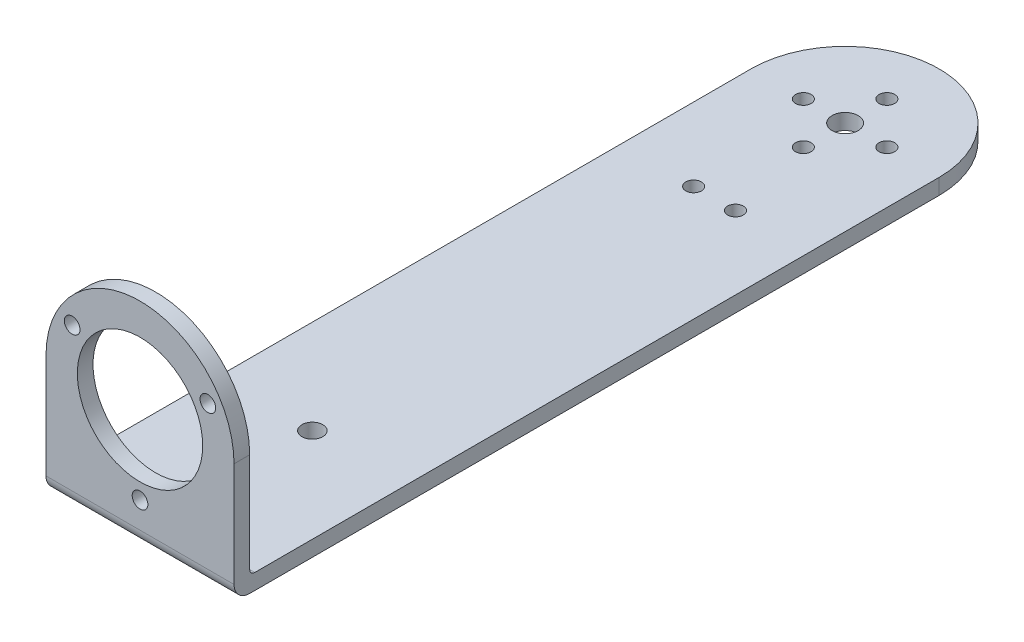
ISO-10303-21;
HEADER;
FILE_DESCRIPTION(('STEP AP214'),'2;1');
FILE_NAME('part.step','',(''),(''),'','','');
FILE_SCHEMA(('AUTOMOTIVE_DESIGN { 1 0 10303 214 1 1 1 1 }'));
ENDSEC;
DATA;
#1=APPLICATION_CONTEXT('core data for automotive mechanical design processes');
#2=APPLICATION_PROTOCOL_DEFINITION('international standard','automotive_design',2000,#1);
#3=PRODUCT_CONTEXT('',#1,'mechanical');
#4=PRODUCT('Part','Part','',(#3));
#5=PRODUCT_RELATED_PRODUCT_CATEGORY('part','',(#4));
#6=PRODUCT_DEFINITION_FORMATION('','',#4);
#7=PRODUCT_DEFINITION_CONTEXT('part definition',#1,'design');
#8=PRODUCT_DEFINITION('design','',#6,#7);
#9=PRODUCT_DEFINITION_SHAPE('','',#8);
#10=(LENGTH_UNIT() NAMED_UNIT(*) SI_UNIT(.MILLI.,.METRE.));
#11=(NAMED_UNIT(*) PLANE_ANGLE_UNIT() SI_UNIT($,.RADIAN.));
#12=(NAMED_UNIT(*) SI_UNIT($,.STERADIAN.) SOLID_ANGLE_UNIT());
#13=UNCERTAINTY_MEASURE_WITH_UNIT(LENGTH_MEASURE(1.E-05),#10,'distance_accuracy_value','');
#14=(GEOMETRIC_REPRESENTATION_CONTEXT(3) GLOBAL_UNCERTAINTY_ASSIGNED_CONTEXT((#13)) GLOBAL_UNIT_ASSIGNED_CONTEXT((#10,
#11,#12)) REPRESENTATION_CONTEXT('',''));
#15=CARTESIAN_POINT('',(0.,0.,0.));
#16=DIRECTION('',(0.,0.,1.));
#17=DIRECTION('',(1.,0.,0.));
#18=AXIS2_PLACEMENT_3D('',#15,#16,#17);
#19=CARTESIAN_POINT('',(0.,3.,67.5));
#20=DIRECTION('',(0.,0.,1.));
#21=DIRECTION('',(1.,0.,0.));
#22=AXIS2_PLACEMENT_3D('',#19,#20,#21);
#23=PLANE('',#22);
#24=CARTESIAN_POINT('',(0.,8.,67.5));
#25=DIRECTION('',(0.,0.,1.));
#26=DIRECTION('',(1.,0.,0.));
#27=AXIS2_PLACEMENT_3D('',#24,#25,#26);
#28=CIRCLE('',#27,1.5);
#29=CARTESIAN_POINT('',(1.5,8.,67.5));
#30=VERTEX_POINT('',#29);
#31=EDGE_CURVE('E146',#30,#30,#28,.T.);
#32=ORIENTED_EDGE('',*,*,#31,.F.);
#33=EDGE_LOOP('',(#32));
#34=FACE_BOUND('',#33,.T.);
#35=CARTESIAN_POINT('',(0.,23.,67.5));
#36=DIRECTION('',(0.,0.,1.));
#37=DIRECTION('',(1.,0.,0.));
#38=AXIS2_PLACEMENT_3D('',#35,#36,#37);
#39=CIRCLE('',#38,12.);
#40=CARTESIAN_POINT('',(12.,23.,67.5));
#41=VERTEX_POINT('',#40);
#42=EDGE_CURVE('E337',#41,#41,#39,.T.);
#43=ORIENTED_EDGE('',*,*,#42,.F.);
#44=EDGE_LOOP('',(#43));
#45=FACE_BOUND('',#44,.T.);
#46=CARTESIAN_POINT('',(12.9903810567665,30.5000000000001,67.5));
#47=DIRECTION('',(0.,0.,1.));
#48=DIRECTION('',(1.,0.,0.));
#49=AXIS2_PLACEMENT_3D('',#46,#47,#48);
#50=CIRCLE('',#49,1.5);
#51=CARTESIAN_POINT('',(14.4903810567665,30.5000000000001,67.5));
#52=VERTEX_POINT('',#51);
#53=EDGE_CURVE('E346',#52,#52,#50,.T.);
#54=ORIENTED_EDGE('',*,*,#53,.F.);
#55=EDGE_LOOP('',(#54));
#56=FACE_BOUND('',#55,.T.);
#57=CARTESIAN_POINT('',(-12.9903810567665,30.5000000000001,67.5));
#58=DIRECTION('',(0.,0.,1.));
#59=DIRECTION('',(1.,0.,0.));
#60=AXIS2_PLACEMENT_3D('',#57,#58,#59);
#61=CIRCLE('',#60,1.5);
#62=CARTESIAN_POINT('',(-11.4903810567665,30.5000000000001,67.5));
#63=VERTEX_POINT('',#62);
#64=EDGE_CURVE('E349',#63,#63,#61,.T.);
#65=ORIENTED_EDGE('',*,*,#64,.F.);
#66=EDGE_LOOP('',(#65));
#67=FACE_BOUND('',#66,.T.);
#68=DIRECTION('',(0.,-1.,0.));
#69=VECTOR('',#68,1.);
#70=CARTESIAN_POINT('',(-18.,3.,67.5));
#71=LINE('',#70,#69);
#72=CARTESIAN_POINT('',(-18.,23.,67.5));
#73=VERTEX_POINT('',#72);
#74=CARTESIAN_POINT('',(-18.,3.,67.5));
#75=VERTEX_POINT('',#74);
#76=EDGE_CURVE('E127',#73,#75,#71,.T.);
#77=ORIENTED_EDGE('',*,*,#76,.T.);
#78=DIRECTION('',(-1.,0.,0.));
#79=VECTOR('',#78,1.);
#80=CARTESIAN_POINT('',(18.,3.,67.5));
#81=LINE('',#80,#79);
#82=CARTESIAN_POINT('',(18.,3.,67.5));
#83=VERTEX_POINT('',#82);
#84=EDGE_CURVE('E126',#75,#83,#81,.F.);
#85=ORIENTED_EDGE('',*,*,#84,.T.);
#86=DIRECTION('',(0.,-1.,0.));
#87=VECTOR('',#86,1.);
#88=CARTESIAN_POINT('',(18.,3.,67.5));
#89=LINE('',#88,#87);
#90=CARTESIAN_POINT('',(18.,23.,67.5));
#91=VERTEX_POINT('',#90);
#92=EDGE_CURVE('E120',#91,#83,#89,.T.);
#93=ORIENTED_EDGE('',*,*,#92,.F.);
#94=CARTESIAN_POINT('',(0.,23.,67.5));
#95=DIRECTION('',(0.,0.,1.));
#96=DIRECTION('',(1.,0.,0.));
#97=AXIS2_PLACEMENT_3D('',#94,#95,#96);
#98=CIRCLE('',#97,18.);
#99=EDGE_CURVE('E103',#91,#73,#98,.T.);
#100=ORIENTED_EDGE('',*,*,#99,.T.);
#101=EDGE_LOOP('',(#77,#85,#93,#100));
#102=FACE_BOUND('',#101,.T.);
#103=ADVANCED_FACE('F41',(#34,#45,#56,#67,#102),#23,.T.);
#104=CARTESIAN_POINT('',(-18.,44.,64.5));
#105=DIRECTION('',(0.,0.,1.));
#106=DIRECTION('',(1.,0.,0.));
#107=AXIS2_PLACEMENT_3D('',#104,#105,#106);
#108=PLANE('',#107);
#109=CARTESIAN_POINT('',(0.,8.,64.5));
#110=DIRECTION('',(0.,0.,1.));
#111=DIRECTION('',(1.,0.,0.));
#112=AXIS2_PLACEMENT_3D('',#109,#110,#111);
#113=CIRCLE('',#112,1.5);
#114=CARTESIAN_POINT('',(1.5,8.,64.5));
#115=VERTEX_POINT('',#114);
#116=EDGE_CURVE('E114',#115,#115,#113,.T.);
#117=ORIENTED_EDGE('',*,*,#116,.T.);
#118=EDGE_LOOP('',(#117));
#119=FACE_BOUND('',#118,.T.);
#120=CARTESIAN_POINT('',(0.,23.,64.5));
#121=DIRECTION('',(0.,0.,1.));
#122=DIRECTION('',(1.,0.,0.));
#123=AXIS2_PLACEMENT_3D('',#120,#121,#122);
#124=CIRCLE('',#123,12.);
#125=CARTESIAN_POINT('',(12.,23.,64.5));
#126=VERTEX_POINT('',#125);
#127=EDGE_CURVE('E149',#126,#126,#124,.T.);
#128=ORIENTED_EDGE('',*,*,#127,.T.);
#129=EDGE_LOOP('',(#128));
#130=FACE_BOUND('',#129,.T.);
#131=CARTESIAN_POINT('',(12.9903810567665,30.5000000000001,64.5));
#132=DIRECTION('',(0.,0.,1.));
#133=DIRECTION('',(1.,0.,0.));
#134=AXIS2_PLACEMENT_3D('',#131,#132,#133);
#135=CIRCLE('',#134,1.5);
#136=CARTESIAN_POINT('',(14.4903810567665,30.5000000000001,64.5));
#137=VERTEX_POINT('',#136);
#138=EDGE_CURVE('E145',#137,#137,#135,.T.);
#139=ORIENTED_EDGE('',*,*,#138,.T.);
#140=EDGE_LOOP('',(#139));
#141=FACE_BOUND('',#140,.T.);
#142=CARTESIAN_POINT('',(-12.9903810567665,30.5000000000001,64.5));
#143=DIRECTION('',(0.,0.,1.));
#144=DIRECTION('',(1.,0.,0.));
#145=AXIS2_PLACEMENT_3D('',#142,#143,#144);
#146=CIRCLE('',#145,1.5);
#147=CARTESIAN_POINT('',(-11.4903810567665,30.5000000000001,64.5));
#148=VERTEX_POINT('',#147);
#149=EDGE_CURVE('E142',#148,#148,#146,.T.);
#150=ORIENTED_EDGE('',*,*,#149,.T.);
#151=EDGE_LOOP('',(#150));
#152=FACE_BOUND('',#151,.T.);
#153=DIRECTION('',(0.,-1.,0.));
#154=VECTOR('',#153,1.);
#155=CARTESIAN_POINT('',(18.,44.,64.5));
#156=LINE('',#155,#154);
#157=CARTESIAN_POINT('',(18.,23.,64.5));
#158=VERTEX_POINT('',#157);
#159=CARTESIAN_POINT('',(18.,4.,64.5));
#160=VERTEX_POINT('',#159);
#161=EDGE_CURVE('E123',#158,#160,#156,.T.);
#162=ORIENTED_EDGE('',*,*,#161,.T.);
#163=DIRECTION('',(-1.,0.,0.));
#164=VECTOR('',#163,1.);
#165=CARTESIAN_POINT('',(-18.,4.,64.5));
#166=LINE('',#165,#164);
#167=CARTESIAN_POINT('',(-18.,4.,64.5));
#168=VERTEX_POINT('',#167);
#169=EDGE_CURVE('E161',#160,#168,#166,.T.);
#170=ORIENTED_EDGE('',*,*,#169,.T.);
#171=DIRECTION('',(0.,-1.,0.));
#172=VECTOR('',#171,1.);
#173=CARTESIAN_POINT('',(-18.,44.,64.5));
#174=LINE('',#173,#172);
#175=CARTESIAN_POINT('',(-18.,23.,64.5));
#176=VERTEX_POINT('',#175);
#177=EDGE_CURVE('E168',#176,#168,#174,.T.);
#178=ORIENTED_EDGE('',*,*,#177,.F.);
#179=CARTESIAN_POINT('',(0.,23.,64.5));
#180=DIRECTION('',(0.,0.,1.));
#181=DIRECTION('',(1.,0.,0.));
#182=AXIS2_PLACEMENT_3D('',#179,#180,#181);
#183=CIRCLE('',#182,18.);
#184=EDGE_CURVE('E139',#158,#176,#183,.T.);
#185=ORIENTED_EDGE('',*,*,#184,.F.);
#186=EDGE_LOOP('',(#162,#170,#178,#185));
#187=FACE_BOUND('',#186,.T.);
#188=ADVANCED_FACE('F167',(#119,#130,#141,#152,#187),#108,.F.);
#189=CARTESIAN_POINT('',(0.,3.,-67.5));
#190=DIRECTION('',(0.,-1.,0.));
#191=DIRECTION('',(0.,0.,-1.));
#192=AXIS2_PLACEMENT_3D('',#189,#190,#191);
#193=CYLINDRICAL_SURFACE('',#192,18.);
#194=CARTESIAN_POINT('',(0.,0.,-67.5));
#195=DIRECTION('',(0.,1.,0.));
#196=DIRECTION('',(0.,0.,1.));
#197=AXIS2_PLACEMENT_3D('',#194,#195,#196);
#198=CIRCLE('',#197,18.);
#199=CARTESIAN_POINT('',(18.,0.,-67.5));
#200=VERTEX_POINT('',#199);
#201=CARTESIAN_POINT('',(-18.,0.,-67.5));
#202=VERTEX_POINT('',#201);
#203=EDGE_CURVE('E211',#200,#202,#198,.T.);
#204=ORIENTED_EDGE('',*,*,#203,.T.);
#205=DIRECTION('',(0.,-1.,0.));
#206=VECTOR('',#205,1.);
#207=CARTESIAN_POINT('',(-18.,3.,-67.5));
#208=LINE('',#207,#206);
#209=CARTESIAN_POINT('',(-18.,3.,-67.5));
#210=VERTEX_POINT('',#209);
#211=EDGE_CURVE('E130',#210,#202,#208,.T.);
#212=ORIENTED_EDGE('',*,*,#211,.F.);
#213=CARTESIAN_POINT('',(0.,3.,-67.5));
#214=DIRECTION('',(0.,1.,0.));
#215=DIRECTION('',(0.,0.,1.));
#216=AXIS2_PLACEMENT_3D('',#213,#214,#215);
#217=CIRCLE('',#216,18.);
#218=CARTESIAN_POINT('',(18.,3.,-67.5));
#219=VERTEX_POINT('',#218);
#220=EDGE_CURVE('E181',#219,#210,#217,.T.);
#221=ORIENTED_EDGE('',*,*,#220,.F.);
#222=DIRECTION('',(0.,-1.,0.));
#223=VECTOR('',#222,1.);
#224=CARTESIAN_POINT('',(18.,3.,-67.5));
#225=LINE('',#224,#223);
#226=EDGE_CURVE('E128',#219,#200,#225,.T.);
#227=ORIENTED_EDGE('',*,*,#226,.T.);
#228=EDGE_LOOP('',(#204,#212,#221,#227));
#229=FACE_BOUND('',#228,.T.);
#230=ADVANCED_FACE('F261',(#229),#193,.T.);
#231=CARTESIAN_POINT('',(-18.,3.,0.));
#232=DIRECTION('',(-1.,0.,0.));
#233=DIRECTION('',(0.,0.,1.));
#234=AXIS2_PLACEMENT_3D('',#231,#232,#233);
#235=PLANE('',#234);
#236=DIRECTION('',(0.,0.,-1.));
#237=VECTOR('',#236,1.);
#238=CARTESIAN_POINT('',(-18.,0.,0.));
#239=LINE('',#238,#237);
#240=CARTESIAN_POINT('',(-18.,0.,64.5));
#241=VERTEX_POINT('',#240);
#242=EDGE_CURVE('E214',#241,#202,#239,.T.);
#243=ORIENTED_EDGE('',*,*,#242,.F.);
#244=CARTESIAN_POINT('',(-18.,3.,64.5));
#245=DIRECTION('',(-1.,0.,0.));
#246=DIRECTION('',(0.,0.,1.));
#247=AXIS2_PLACEMENT_3D('',#244,#245,#246);
#248=CIRCLE('',#247,3.);
#249=EDGE_CURVE('E156',#241,#75,#248,.T.);
#250=ORIENTED_EDGE('',*,*,#249,.T.);
#251=ORIENTED_EDGE('',*,*,#76,.F.);
#252=DIRECTION('',(0.,0.,1.));
#253=VECTOR('',#252,1.);
#254=CARTESIAN_POINT('',(-18.,23.,63.5));
#255=LINE('',#254,#253);
#256=EDGE_CURVE('E109',#176,#73,#255,.T.);
#257=ORIENTED_EDGE('',*,*,#256,.F.);
#258=ORIENTED_EDGE('',*,*,#177,.T.);
#259=CARTESIAN_POINT('',(-18.,4.,63.5));
#260=DIRECTION('',(-1.,0.,0.));
#261=DIRECTION('',(0.,0.,1.));
#262=AXIS2_PLACEMENT_3D('',#259,#260,#261);
#263=CIRCLE('',#262,1.);
#264=CARTESIAN_POINT('',(-18.,3.,63.5));
#265=VERTEX_POINT('',#264);
#266=EDGE_CURVE('E49',#168,#265,#263,.F.);
#267=ORIENTED_EDGE('',*,*,#266,.T.);
#268=DIRECTION('',(0.,0.,-1.));
#269=VECTOR('',#268,1.);
#270=CARTESIAN_POINT('',(-18.,3.,0.));
#271=LINE('',#270,#269);
#272=EDGE_CURVE('E185',#265,#210,#271,.T.);
#273=ORIENTED_EDGE('',*,*,#272,.T.);
#274=ORIENTED_EDGE('',*,*,#211,.T.);
#275=EDGE_LOOP('',(#243,#250,#251,#257,#258,#267,#273,#274));
#276=FACE_BOUND('',#275,.T.);
#277=ADVANCED_FACE('F172',(#276),#235,.T.);
#278=CARTESIAN_POINT('',(3.99999999999999,3.,-42.5));
#279=DIRECTION('',(0.,-1.,0.));
#280=DIRECTION('',(0.,0.,-1.));
#281=AXIS2_PLACEMENT_3D('',#278,#279,#280);
#282=CYLINDRICAL_SURFACE('',#281,1.5);
#283=CARTESIAN_POINT('',(3.99999999999999,3.,-42.5));
#284=DIRECTION('',(0.,1.,0.));
#285=DIRECTION('',(0.,0.,1.));
#286=AXIS2_PLACEMENT_3D('',#283,#284,#285);
#287=CIRCLE('',#286,1.5);
#288=CARTESIAN_POINT('',(3.99999999999999,3.,-41.));
#289=VERTEX_POINT('',#288);
#290=EDGE_CURVE('E204',#289,#289,#287,.F.);
#291=ORIENTED_EDGE('',*,*,#290,.F.);
#292=EDGE_LOOP('',(#291));
#293=FACE_BOUND('',#292,.T.);
#294=CARTESIAN_POINT('',(3.99999999999999,0.,-42.5));
#295=DIRECTION('',(0.,1.,0.));
#296=DIRECTION('',(0.,0.,1.));
#297=AXIS2_PLACEMENT_3D('',#294,#295,#296);
#298=CIRCLE('',#297,1.5);
#299=CARTESIAN_POINT('',(3.99999999999999,0.,-41.));
#300=VERTEX_POINT('',#299);
#301=EDGE_CURVE('E233',#300,#300,#298,.F.);
#302=ORIENTED_EDGE('',*,*,#301,.T.);
#303=EDGE_LOOP('',(#302));
#304=FACE_BOUND('',#303,.T.);
#305=ADVANCED_FACE('F271',(#293,#304),#282,.F.);
#306=CARTESIAN_POINT('',(-4.,3.,-42.5));
#307=DIRECTION('',(0.,-1.,0.));
#308=DIRECTION('',(0.,0.,-1.));
#309=AXIS2_PLACEMENT_3D('',#306,#307,#308);
#310=CYLINDRICAL_SURFACE('',#309,1.5);
#311=CARTESIAN_POINT('',(-4.,3.,-42.5));
#312=DIRECTION('',(0.,1.,0.));
#313=DIRECTION('',(0.,0.,1.));
#314=AXIS2_PLACEMENT_3D('',#311,#312,#313);
#315=CIRCLE('',#314,1.5);
#316=CARTESIAN_POINT('',(-4.,3.,-41.));
#317=VERTEX_POINT('',#316);
#318=EDGE_CURVE('E201',#317,#317,#315,.T.);
#319=ORIENTED_EDGE('',*,*,#318,.T.);
#320=EDGE_LOOP('',(#319));
#321=FACE_BOUND('',#320,.T.);
#322=CARTESIAN_POINT('',(-4.,0.,-42.5));
#323=DIRECTION('',(0.,1.,0.));
#324=DIRECTION('',(0.,0.,1.));
#325=AXIS2_PLACEMENT_3D('',#322,#323,#324);
#326=CIRCLE('',#325,1.5);
#327=CARTESIAN_POINT('',(-4.,0.,-41.));
#328=VERTEX_POINT('',#327);
#329=EDGE_CURVE('E230',#328,#328,#326,.T.);
#330=ORIENTED_EDGE('',*,*,#329,.F.);
#331=EDGE_LOOP('',(#330));
#332=FACE_BOUND('',#331,.T.);
#333=ADVANCED_FACE('F312',(#321,#332),#310,.F.);
#334=CARTESIAN_POINT('',(0.,3.,-67.5));
#335=DIRECTION('',(0.,-1.,0.));
#336=DIRECTION('',(0.,0.,-1.));
#337=AXIS2_PLACEMENT_3D('',#334,#335,#336);
#338=CYLINDRICAL_SURFACE('',#337,2.5);
#339=CARTESIAN_POINT('',(0.,3.,-67.5));
#340=DIRECTION('',(0.,1.,0.));
#341=DIRECTION('',(0.,0.,1.));
#342=AXIS2_PLACEMENT_3D('',#339,#340,#341);
#343=CIRCLE('',#342,2.5);
#344=CARTESIAN_POINT('',(0.,3.,-65.));
#345=VERTEX_POINT('',#344);
#346=EDGE_CURVE('E198',#345,#345,#343,.T.);
#347=ORIENTED_EDGE('',*,*,#346,.T.);
#348=EDGE_LOOP('',(#347));
#349=FACE_BOUND('',#348,.T.);
#350=CARTESIAN_POINT('',(0.,0.,-67.5));
#351=DIRECTION('',(0.,1.,0.));
#352=DIRECTION('',(0.,0.,1.));
#353=AXIS2_PLACEMENT_3D('',#350,#351,#352);
#354=CIRCLE('',#353,2.5);
#355=CARTESIAN_POINT('',(0.,0.,-65.));
#356=VERTEX_POINT('',#355);
#357=EDGE_CURVE('E227',#356,#356,#354,.T.);
#358=ORIENTED_EDGE('',*,*,#357,.F.);
#359=EDGE_LOOP('',(#358));
#360=FACE_BOUND('',#359,.T.);
#361=ADVANCED_FACE('F460',(#349,#360),#338,.F.);
#362=CARTESIAN_POINT('',(0.,3.,-59.5));
#363=DIRECTION('',(0.,-1.,0.));
#364=DIRECTION('',(0.,0.,-1.));
#365=AXIS2_PLACEMENT_3D('',#362,#363,#364);
#366=CYLINDRICAL_SURFACE('',#365,1.5);
#367=CARTESIAN_POINT('',(0.,3.,-59.5));
#368=DIRECTION('',(0.,1.,0.));
#369=DIRECTION('',(0.,0.,1.));
#370=AXIS2_PLACEMENT_3D('',#367,#368,#369);
#371=CIRCLE('',#370,1.5);
#372=CARTESIAN_POINT('',(0.,3.,-58.));
#373=VERTEX_POINT('',#372);
#374=EDGE_CURVE('E195',#373,#373,#371,.T.);
#375=ORIENTED_EDGE('',*,*,#374,.T.);
#376=EDGE_LOOP('',(#375));
#377=FACE_BOUND('',#376,.T.);
#378=CARTESIAN_POINT('',(0.,0.,-59.5));
#379=DIRECTION('',(0.,1.,0.));
#380=DIRECTION('',(0.,0.,1.));
#381=AXIS2_PLACEMENT_3D('',#378,#379,#380);
#382=CIRCLE('',#381,1.5);
#383=CARTESIAN_POINT('',(0.,0.,-58.));
#384=VERTEX_POINT('',#383);
#385=EDGE_CURVE('E224',#384,#384,#382,.T.);
#386=ORIENTED_EDGE('',*,*,#385,.F.);
#387=EDGE_LOOP('',(#386));
#388=FACE_BOUND('',#387,.T.);
#389=ADVANCED_FACE('F451',(#377,#388),#366,.F.);
#390=CARTESIAN_POINT('',(0.,3.,34.5));
#391=DIRECTION('',(0.,-1.,0.));
#392=DIRECTION('',(0.,0.,-1.));
#393=AXIS2_PLACEMENT_3D('',#390,#391,#392);
#394=CYLINDRICAL_SURFACE('',#393,2.);
#395=CARTESIAN_POINT('',(0.,3.,34.5));
#396=DIRECTION('',(0.,1.,0.));
#397=DIRECTION('',(0.,0.,1.));
#398=AXIS2_PLACEMENT_3D('',#395,#396,#397);
#399=CIRCLE('',#398,2.);
#400=CARTESIAN_POINT('',(0.,3.,36.5));
#401=VERTEX_POINT('',#400);
#402=EDGE_CURVE('E192',#401,#401,#399,.T.);
#403=ORIENTED_EDGE('',*,*,#402,.T.);
#404=EDGE_LOOP('',(#403));
#405=FACE_BOUND('',#404,.T.);
#406=CARTESIAN_POINT('',(0.,0.,34.5));
#407=DIRECTION('',(0.,1.,0.));
#408=DIRECTION('',(0.,0.,1.));
#409=AXIS2_PLACEMENT_3D('',#406,#407,#408);
#410=CIRCLE('',#409,2.);
#411=CARTESIAN_POINT('',(0.,0.,36.5));
#412=VERTEX_POINT('',#411);
#413=EDGE_CURVE('E221',#412,#412,#410,.T.);
#414=ORIENTED_EDGE('',*,*,#413,.F.);
#415=EDGE_LOOP('',(#414));
#416=FACE_BOUND('',#415,.T.);
#417=ADVANCED_FACE('F443',(#405,#416),#394,.F.);
#418=CARTESIAN_POINT('',(8.,3.,-67.5));
#419=DIRECTION('',(0.,-1.,0.));
#420=DIRECTION('',(0.,0.,-1.));
#421=AXIS2_PLACEMENT_3D('',#418,#419,#420);
#422=CYLINDRICAL_SURFACE('',#421,1.5);
#423=CARTESIAN_POINT('',(8.,3.,-67.5));
#424=DIRECTION('',(0.,1.,0.));
#425=DIRECTION('',(0.,0.,1.));
#426=AXIS2_PLACEMENT_3D('',#423,#424,#425);
#427=CIRCLE('',#426,1.5);
#428=CARTESIAN_POINT('',(8.,3.,-66.));
#429=VERTEX_POINT('',#428);
#430=EDGE_CURVE('E189',#429,#429,#427,.T.);
#431=ORIENTED_EDGE('',*,*,#430,.T.);
#432=EDGE_LOOP('',(#431));
#433=FACE_BOUND('',#432,.T.);
#434=CARTESIAN_POINT('',(8.,0.,-67.5));
#435=DIRECTION('',(0.,1.,0.));
#436=DIRECTION('',(0.,0.,1.));
#437=AXIS2_PLACEMENT_3D('',#434,#435,#436);
#438=CIRCLE('',#437,1.5);
#439=CARTESIAN_POINT('',(8.,0.,-66.));
#440=VERTEX_POINT('',#439);
#441=EDGE_CURVE('E218',#440,#440,#438,.T.);
#442=ORIENTED_EDGE('',*,*,#441,.F.);
#443=EDGE_LOOP('',(#442));
#444=FACE_BOUND('',#443,.T.);
#445=ADVANCED_FACE('F405',(#433,#444),#422,.F.);
#446=CARTESIAN_POINT('',(18.,3.,0.));
#447=DIRECTION('',(-1.,0.,0.));
#448=DIRECTION('',(0.,0.,1.));
#449=AXIS2_PLACEMENT_3D('',#446,#447,#448);
#450=PLANE('',#449);
#451=ORIENTED_EDGE('',*,*,#92,.T.);
#452=CARTESIAN_POINT('',(18.,3.,64.5));
#453=DIRECTION('',(-1.,0.,0.));
#454=DIRECTION('',(0.,0.,1.));
#455=AXIS2_PLACEMENT_3D('',#452,#453,#454);
#456=CIRCLE('',#455,3.);
#457=CARTESIAN_POINT('',(18.,0.,64.5));
#458=VERTEX_POINT('',#457);
#459=EDGE_CURVE('E159',#83,#458,#456,.F.);
#460=ORIENTED_EDGE('',*,*,#459,.T.);
#461=DIRECTION('',(0.,0.,-1.));
#462=VECTOR('',#461,1.);
#463=CARTESIAN_POINT('',(18.,0.,0.));
#464=LINE('',#463,#462);
#465=EDGE_CURVE('E216',#458,#200,#464,.T.);
#466=ORIENTED_EDGE('',*,*,#465,.T.);
#467=ORIENTED_EDGE('',*,*,#226,.F.);
#468=DIRECTION('',(0.,0.,-1.));
#469=VECTOR('',#468,1.);
#470=CARTESIAN_POINT('',(18.,3.,0.));
#471=LINE('',#470,#469);
#472=CARTESIAN_POINT('',(18.,3.,63.5));
#473=VERTEX_POINT('',#472);
#474=EDGE_CURVE('E187',#473,#219,#471,.T.);
#475=ORIENTED_EDGE('',*,*,#474,.F.);
#476=CARTESIAN_POINT('',(18.,4.,63.5));
#477=DIRECTION('',(-1.,0.,0.));
#478=DIRECTION('',(0.,0.,1.));
#479=AXIS2_PLACEMENT_3D('',#476,#477,#478);
#480=CIRCLE('',#479,1.);
#481=EDGE_CURVE('E11',#473,#160,#480,.T.);
#482=ORIENTED_EDGE('',*,*,#481,.T.);
#483=ORIENTED_EDGE('',*,*,#161,.F.);
#484=DIRECTION('',(0.,0.,1.));
#485=VECTOR('',#484,1.);
#486=CARTESIAN_POINT('',(18.,23.,63.5));
#487=LINE('',#486,#485);
#488=EDGE_CURVE('E106',#158,#91,#487,.T.);
#489=ORIENTED_EDGE('',*,*,#488,.T.);
#490=EDGE_LOOP('',(#451,#460,#466,#467,#475,#482,#483,#489));
#491=FACE_BOUND('',#490,.T.);
#492=ADVANCED_FACE('F119',(#491),#450,.F.);
#493=CARTESIAN_POINT('',(-8.00000000000001,3.,-67.5));
#494=DIRECTION('',(0.,-1.,0.));
#495=DIRECTION('',(0.,0.,-1.));
#496=AXIS2_PLACEMENT_3D('',#493,#494,#495);
#497=CYLINDRICAL_SURFACE('',#496,1.5);
#498=CARTESIAN_POINT('',(-8.00000000000001,3.,-67.5));
#499=DIRECTION('',(0.,1.,0.));
#500=DIRECTION('',(0.,0.,1.));
#501=AXIS2_PLACEMENT_3D('',#498,#499,#500);
#502=CIRCLE('',#501,1.5);
#503=CARTESIAN_POINT('',(-8.00000000000001,3.,-66.));
#504=VERTEX_POINT('',#503);
#505=EDGE_CURVE('E178',#504,#504,#502,.T.);
#506=ORIENTED_EDGE('',*,*,#505,.T.);
#507=EDGE_LOOP('',(#506));
#508=FACE_BOUND('',#507,.T.);
#509=CARTESIAN_POINT('',(-8.00000000000001,0.,-67.5));
#510=DIRECTION('',(0.,1.,0.));
#511=DIRECTION('',(0.,0.,1.));
#512=AXIS2_PLACEMENT_3D('',#509,#510,#511);
#513=CIRCLE('',#512,1.5);
#514=CARTESIAN_POINT('',(-8.00000000000001,0.,-66.));
#515=VERTEX_POINT('',#514);
#516=EDGE_CURVE('E174',#515,#515,#513,.T.);
#517=ORIENTED_EDGE('',*,*,#516,.F.);
#518=EDGE_LOOP('',(#517));
#519=FACE_BOUND('',#518,.T.);
#520=ADVANCED_FACE('F243',(#508,#519),#497,.F.);
#521=CARTESIAN_POINT('',(0.,3.,-75.5));
#522=DIRECTION('',(0.,-1.,0.));
#523=DIRECTION('',(0.,0.,-1.));
#524=AXIS2_PLACEMENT_3D('',#521,#522,#523);
#525=CYLINDRICAL_SURFACE('',#524,1.5);
#526=CARTESIAN_POINT('',(0.,3.,-75.5));
#527=DIRECTION('',(0.,1.,0.));
#528=DIRECTION('',(0.,0.,1.));
#529=AXIS2_PLACEMENT_3D('',#526,#527,#528);
#530=CIRCLE('',#529,1.5);
#531=CARTESIAN_POINT('',(0.,3.,-74.));
#532=VERTEX_POINT('',#531);
#533=EDGE_CURVE('E133',#532,#532,#530,.T.);
#534=ORIENTED_EDGE('',*,*,#533,.T.);
#535=EDGE_LOOP('',(#534));
#536=FACE_BOUND('',#535,.T.);
#537=CARTESIAN_POINT('',(0.,0.,-75.5));
#538=DIRECTION('',(0.,1.,0.));
#539=DIRECTION('',(0.,0.,1.));
#540=AXIS2_PLACEMENT_3D('',#537,#538,#539);
#541=CIRCLE('',#540,1.5);
#542=CARTESIAN_POINT('',(0.,0.,-74.));
#543=VERTEX_POINT('',#542);
#544=EDGE_CURVE('E182',#543,#543,#541,.T.);
#545=ORIENTED_EDGE('',*,*,#544,.F.);
#546=EDGE_LOOP('',(#545));
#547=FACE_BOUND('',#546,.T.);
#548=ADVANCED_FACE('F240',(#536,#547),#525,.F.);
#549=CARTESIAN_POINT('',(0.,3.,0.));
#550=DIRECTION('',(0.,1.,0.));
#551=DIRECTION('',(0.,0.,1.));
#552=AXIS2_PLACEMENT_3D('',#549,#550,#551);
#553=PLANE('',#552);
#554=ORIENTED_EDGE('',*,*,#272,.F.);
#555=DIRECTION('',(-1.,0.,0.));
#556=VECTOR('',#555,1.);
#557=CARTESIAN_POINT('',(0.,3.,63.5));
#558=LINE('',#557,#556);
#559=EDGE_CURVE('E62',#265,#473,#558,.F.);
#560=ORIENTED_EDGE('',*,*,#559,.T.);
#561=ORIENTED_EDGE('',*,*,#474,.T.);
#562=ORIENTED_EDGE('',*,*,#220,.T.);
#563=EDGE_LOOP('',(#554,#560,#561,#562));
#564=FACE_BOUND('',#563,.T.);
#565=ORIENTED_EDGE('',*,*,#505,.F.);
#566=EDGE_LOOP('',(#565));
#567=FACE_BOUND('',#566,.T.);
#568=ORIENTED_EDGE('',*,*,#430,.F.);
#569=EDGE_LOOP('',(#568));
#570=FACE_BOUND('',#569,.T.);
#571=ORIENTED_EDGE('',*,*,#402,.F.);
#572=EDGE_LOOP('',(#571));
#573=FACE_BOUND('',#572,.T.);
#574=ORIENTED_EDGE('',*,*,#374,.F.);
#575=EDGE_LOOP('',(#574));
#576=FACE_BOUND('',#575,.T.);
#577=ORIENTED_EDGE('',*,*,#346,.F.);
#578=EDGE_LOOP('',(#577));
#579=FACE_BOUND('',#578,.T.);
#580=ORIENTED_EDGE('',*,*,#318,.F.);
#581=EDGE_LOOP('',(#580));
#582=FACE_BOUND('',#581,.T.);
#583=ORIENTED_EDGE('',*,*,#290,.T.);
#584=EDGE_LOOP('',(#583));
#585=FACE_BOUND('',#584,.T.);
#586=ORIENTED_EDGE('',*,*,#533,.F.);
#587=EDGE_LOOP('',(#586));
#588=FACE_BOUND('',#587,.T.);
#589=ADVANCED_FACE('F242',(#564,#567,#570,#573,#576,#579,#582,#585,#588),#553,.T.);
#590=CARTESIAN_POINT('',(0.,0.,0.));
#591=DIRECTION('',(0.,1.,0.));
#592=DIRECTION('',(0.,0.,1.));
#593=AXIS2_PLACEMENT_3D('',#590,#591,#592);
#594=PLANE('',#593);
#595=ORIENTED_EDGE('',*,*,#516,.T.);
#596=EDGE_LOOP('',(#595));
#597=FACE_BOUND('',#596,.T.);
#598=ORIENTED_EDGE('',*,*,#465,.F.);
#599=DIRECTION('',(-1.,0.,0.));
#600=VECTOR('',#599,1.);
#601=CARTESIAN_POINT('',(-18.,0.,64.5));
#602=LINE('',#601,#600);
#603=EDGE_CURVE('E141',#458,#241,#602,.T.);
#604=ORIENTED_EDGE('',*,*,#603,.T.);
#605=ORIENTED_EDGE('',*,*,#242,.T.);
#606=ORIENTED_EDGE('',*,*,#203,.F.);
#607=EDGE_LOOP('',(#598,#604,#605,#606));
#608=FACE_BOUND('',#607,.T.);
#609=ORIENTED_EDGE('',*,*,#441,.T.);
#610=EDGE_LOOP('',(#609));
#611=FACE_BOUND('',#610,.T.);
#612=ORIENTED_EDGE('',*,*,#413,.T.);
#613=EDGE_LOOP('',(#612));
#614=FACE_BOUND('',#613,.T.);
#615=ORIENTED_EDGE('',*,*,#385,.T.);
#616=EDGE_LOOP('',(#615));
#617=FACE_BOUND('',#616,.T.);
#618=ORIENTED_EDGE('',*,*,#357,.T.);
#619=EDGE_LOOP('',(#618));
#620=FACE_BOUND('',#619,.T.);
#621=ORIENTED_EDGE('',*,*,#329,.T.);
#622=EDGE_LOOP('',(#621));
#623=FACE_BOUND('',#622,.T.);
#624=ORIENTED_EDGE('',*,*,#301,.F.);
#625=EDGE_LOOP('',(#624));
#626=FACE_BOUND('',#625,.T.);
#627=ORIENTED_EDGE('',*,*,#544,.T.);
#628=EDGE_LOOP('',(#627));
#629=FACE_BOUND('',#628,.T.);
#630=ADVANCED_FACE('F238',(#597,#608,#611,#614,#617,#620,#623,#626,#629),#594,.F.);
#631=CARTESIAN_POINT('',(0.,23.,63.5));
#632=DIRECTION('',(0.,0.,1.));
#633=DIRECTION('',(1.,0.,0.));
#634=AXIS2_PLACEMENT_3D('',#631,#632,#633);
#635=CYLINDRICAL_SURFACE('',#634,18.);
#636=ORIENTED_EDGE('',*,*,#184,.T.);
#637=ORIENTED_EDGE('',*,*,#256,.T.);
#638=ORIENTED_EDGE('',*,*,#99,.F.);
#639=ORIENTED_EDGE('',*,*,#488,.F.);
#640=EDGE_LOOP('',(#636,#637,#638,#639));
#641=FACE_BOUND('',#640,.T.);
#642=ADVANCED_FACE('F105',(#641),#635,.T.);
#643=CARTESIAN_POINT('',(-12.9903810567665,30.5000000000001,63.5));
#644=DIRECTION('',(0.,0.,1.));
#645=DIRECTION('',(1.,0.,0.));
#646=AXIS2_PLACEMENT_3D('',#643,#644,#645);
#647=CYLINDRICAL_SURFACE('',#646,1.5);
#648=ORIENTED_EDGE('',*,*,#64,.T.);
#649=EDGE_LOOP('',(#648));
#650=FACE_BOUND('',#649,.T.);
#651=ORIENTED_EDGE('',*,*,#149,.F.);
#652=EDGE_LOOP('',(#651));
#653=FACE_BOUND('',#652,.T.);
#654=ADVANCED_FACE('F320',(#650,#653),#647,.F.);
#655=CARTESIAN_POINT('',(12.9903810567665,30.5000000000001,63.5));
#656=DIRECTION('',(0.,0.,1.));
#657=DIRECTION('',(1.,0.,0.));
#658=AXIS2_PLACEMENT_3D('',#655,#656,#657);
#659=CYLINDRICAL_SURFACE('',#658,1.5);
#660=ORIENTED_EDGE('',*,*,#53,.T.);
#661=EDGE_LOOP('',(#660));
#662=FACE_BOUND('',#661,.T.);
#663=ORIENTED_EDGE('',*,*,#138,.F.);
#664=EDGE_LOOP('',(#663));
#665=FACE_BOUND('',#664,.T.);
#666=ADVANCED_FACE('F323',(#662,#665),#659,.F.);
#667=CARTESIAN_POINT('',(0.,23.,63.5));
#668=DIRECTION('',(0.,0.,1.));
#669=DIRECTION('',(1.,0.,0.));
#670=AXIS2_PLACEMENT_3D('',#667,#668,#669);
#671=CYLINDRICAL_SURFACE('',#670,12.);
#672=ORIENTED_EDGE('',*,*,#42,.T.);
#673=EDGE_LOOP('',(#672));
#674=FACE_BOUND('',#673,.T.);
#675=ORIENTED_EDGE('',*,*,#127,.F.);
#676=EDGE_LOOP('',(#675));
#677=FACE_BOUND('',#676,.T.);
#678=ADVANCED_FACE('F282',(#674,#677),#671,.F.);
#679=CARTESIAN_POINT('',(0.,8.,63.5));
#680=DIRECTION('',(0.,0.,1.));
#681=DIRECTION('',(1.,0.,0.));
#682=AXIS2_PLACEMENT_3D('',#679,#680,#681);
#683=CYLINDRICAL_SURFACE('',#682,1.5);
#684=ORIENTED_EDGE('',*,*,#31,.T.);
#685=EDGE_LOOP('',(#684));
#686=FACE_BOUND('',#685,.T.);
#687=ORIENTED_EDGE('',*,*,#116,.F.);
#688=EDGE_LOOP('',(#687));
#689=FACE_BOUND('',#688,.T.);
#690=ADVANCED_FACE('F276',(#686,#689),#683,.F.);
#691=CARTESIAN_POINT('',(0.,3.,64.5));
#692=DIRECTION('',(1.,0.,0.));
#693=DIRECTION('',(0.,0.,-1.));
#694=AXIS2_PLACEMENT_3D('',#691,#692,#693);
#695=CYLINDRICAL_SURFACE('',#694,3.);
#696=ORIENTED_EDGE('',*,*,#459,.F.);
#697=ORIENTED_EDGE('',*,*,#84,.F.);
#698=ORIENTED_EDGE('',*,*,#249,.F.);
#699=ORIENTED_EDGE('',*,*,#603,.F.);
#700=EDGE_LOOP('',(#696,#697,#698,#699));
#701=FACE_BOUND('',#700,.T.);
#702=ADVANCED_FACE('F274',(#701),#695,.T.);
#703=CARTESIAN_POINT('',(-18.,4.,63.5));
#704=DIRECTION('',(-1.,0.,0.));
#705=DIRECTION('',(0.,0.,1.));
#706=AXIS2_PLACEMENT_3D('',#703,#704,#705);
#707=CYLINDRICAL_SURFACE('',#706,1.);
#708=ORIENTED_EDGE('',*,*,#481,.F.);
#709=ORIENTED_EDGE('',*,*,#559,.F.);
#710=ORIENTED_EDGE('',*,*,#266,.F.);
#711=ORIENTED_EDGE('',*,*,#169,.F.);
#712=EDGE_LOOP('',(#708,#709,#710,#711));
#713=FACE_BOUND('',#712,.T.);
#714=ADVANCED_FACE('F43',(#713),#707,.F.);
#715=CLOSED_SHELL('',(#103,#188,#230,#277,#305,#333,#361,#389,#417,#445,#492,#520,#548,#589,
#630,#642,#654,#666,#678,#690,#702,#714));
#716=MANIFOLD_SOLID_BREP('B2',#715);
#717=ADVANCED_BREP_SHAPE_REPRESENTATION('',(#18,#716),#14);
#718=SHAPE_DEFINITION_REPRESENTATION(#9,#717);
ENDSEC;
END-ISO-10303-21;
